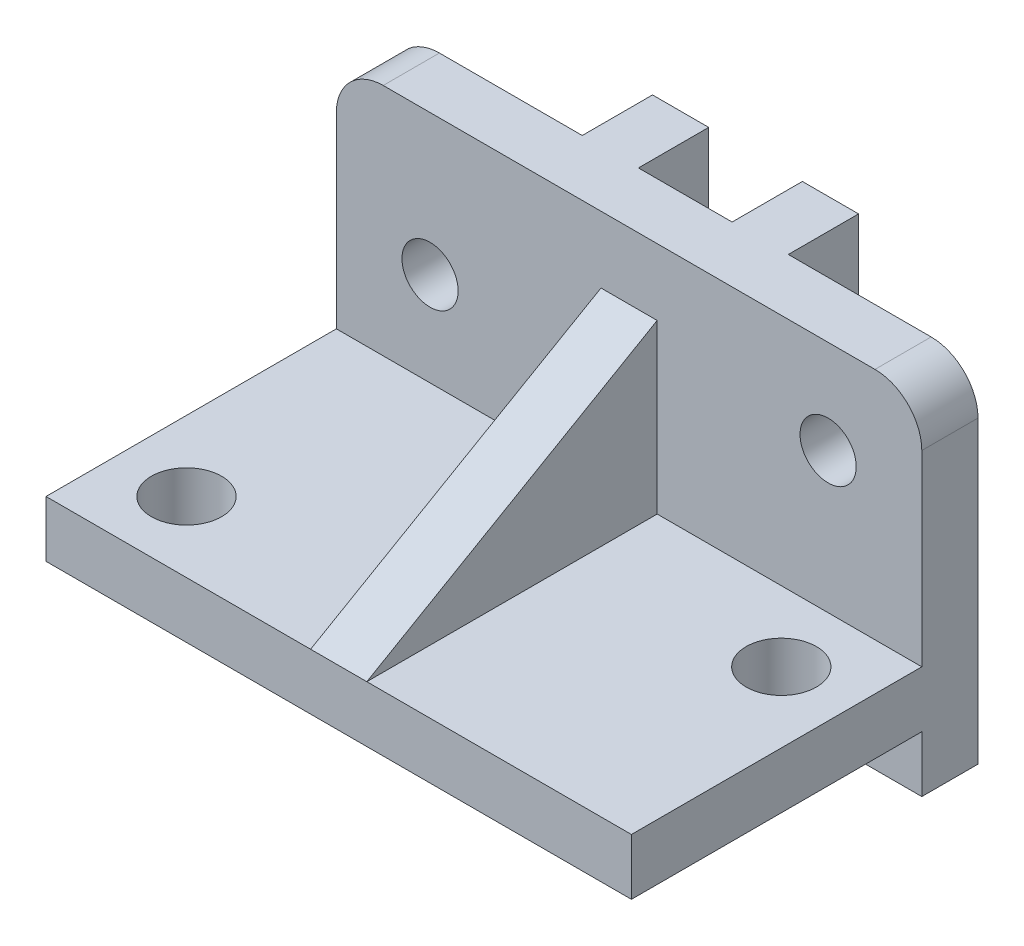
ISO-10303-21;
HEADER;
FILE_DESCRIPTION(('STEP AP214'),'2;1');
FILE_NAME('part.step','',(''),(''),'','','');
FILE_SCHEMA(('AUTOMOTIVE_DESIGN { 1 0 10303 214 1 1 1 1 }'));
ENDSEC;
DATA;
#1=APPLICATION_CONTEXT('core data for automotive mechanical design processes');
#2=APPLICATION_PROTOCOL_DEFINITION('international standard','automotive_design',2000,#1);
#3=PRODUCT_CONTEXT('',#1,'mechanical');
#4=PRODUCT('Part','Part','',(#3));
#5=PRODUCT_RELATED_PRODUCT_CATEGORY('part','',(#4));
#6=PRODUCT_DEFINITION_FORMATION('','',#4);
#7=PRODUCT_DEFINITION_CONTEXT('part definition',#1,'design');
#8=PRODUCT_DEFINITION('design','',#6,#7);
#9=PRODUCT_DEFINITION_SHAPE('','',#8);
#10=(LENGTH_UNIT() NAMED_UNIT(*) SI_UNIT(.MILLI.,.METRE.));
#11=(NAMED_UNIT(*) PLANE_ANGLE_UNIT() SI_UNIT($,.RADIAN.));
#12=(NAMED_UNIT(*) SI_UNIT($,.STERADIAN.) SOLID_ANGLE_UNIT());
#13=UNCERTAINTY_MEASURE_WITH_UNIT(LENGTH_MEASURE(1.E-05),#10,'distance_accuracy_value','');
#14=(GEOMETRIC_REPRESENTATION_CONTEXT(3) GLOBAL_UNCERTAINTY_ASSIGNED_CONTEXT((#13)) GLOBAL_UNIT_ASSIGNED_CONTEXT((#10,
#11,#12)) REPRESENTATION_CONTEXT('',''));
#15=CARTESIAN_POINT('',(0.,0.,0.));
#16=DIRECTION('',(0.,0.,1.));
#17=DIRECTION('',(1.,0.,0.));
#18=AXIS2_PLACEMENT_3D('',#15,#16,#17);
#19=CARTESIAN_POINT('',(0.,12.,0.));
#20=DIRECTION('',(0.,1.,0.));
#21=DIRECTION('',(0.,0.,1.));
#22=AXIS2_PLACEMENT_3D('',#19,#20,#21);
#23=PLANE('',#22);
#24=CARTESIAN_POINT('',(110.,12.,-47.));
#25=DIRECTION('',(0.,1.,0.));
#26=DIRECTION('',(0.,0.,1.));
#27=AXIS2_PLACEMENT_3D('',#24,#25,#26);
#28=CIRCLE('',#27,7.50000000000001);
#29=CARTESIAN_POINT('',(110.,12.,-39.5));
#30=VERTEX_POINT('',#29);
#31=EDGE_CURVE('E237',#30,#30,#28,.T.);
#32=ORIENTED_EDGE('',*,*,#31,.F.);
#33=EDGE_LOOP('',(#32));
#34=FACE_BOUND('',#33,.T.);
#35=DIRECTION('',(1.,0.,0.));
#36=VECTOR('',#35,1.);
#37=CARTESIAN_POINT('',(0.,12.,-62.));
#38=LINE('',#37,#36);
#39=CARTESIAN_POINT('',(68.5,12.,-62.));
#40=VERTEX_POINT('',#39);
#41=CARTESIAN_POINT('',(125.,12.,-62.));
#42=VERTEX_POINT('',#41);
#43=EDGE_CURVE('E213',#40,#42,#38,.T.);
#44=ORIENTED_EDGE('',*,*,#43,.F.);
#45=DIRECTION('',(0.,0.,-1.));
#46=VECTOR('',#45,1.);
#47=CARTESIAN_POINT('',(68.5,12.,-62.));
#48=LINE('',#47,#46);
#49=CARTESIAN_POINT('',(68.5,12.,0.));
#50=VERTEX_POINT('',#49);
#51=EDGE_CURVE('E186',#50,#40,#48,.T.);
#52=ORIENTED_EDGE('',*,*,#51,.F.);
#53=DIRECTION('',(1.,0.,0.));
#54=VECTOR('',#53,1.);
#55=CARTESIAN_POINT('',(0.,12.,0.));
#56=LINE('',#55,#54);
#57=CARTESIAN_POINT('',(125.,12.,0.));
#58=VERTEX_POINT('',#57);
#59=EDGE_CURVE('E196',#50,#58,#56,.T.);
#60=ORIENTED_EDGE('',*,*,#59,.T.);
#61=DIRECTION('',(0.,0.,-1.));
#62=VECTOR('',#61,1.);
#63=CARTESIAN_POINT('',(125.,12.,0.));
#64=LINE('',#63,#62);
#65=EDGE_CURVE('E210',#58,#42,#64,.T.);
#66=ORIENTED_EDGE('',*,*,#65,.T.);
#67=EDGE_LOOP('',(#44,#52,#60,#66));
#68=FACE_BOUND('',#67,.T.);
#69=ADVANCED_FACE('F37',(#34,#68),#23,.T.);
#70=CARTESIAN_POINT('',(15.,12.,-15.));
#71=DIRECTION('',(0.,1.,0.));
#72=DIRECTION('',(0.,0.,1.));
#73=AXIS2_PLACEMENT_3D('',#70,#71,#72);
#74=CIRCLE('',#73,7.5);
#75=CARTESIAN_POINT('',(15.,12.,-7.5));
#76=VERTEX_POINT('',#75);
#77=EDGE_CURVE('E215',#76,#76,#74,.T.);
#78=ORIENTED_EDGE('',*,*,#77,.F.);
#79=EDGE_LOOP('',(#78));
#80=FACE_BOUND('',#79,.T.);
#81=CARTESIAN_POINT('',(0.,12.,0.));
#82=VERTEX_POINT('',#81);
#83=CARTESIAN_POINT('',(56.5,12.,0.));
#84=VERTEX_POINT('',#83);
#85=EDGE_CURVE('E193',#82,#84,#56,.T.);
#86=ORIENTED_EDGE('',*,*,#85,.T.);
#87=DIRECTION('',(0.,0.,1.));
#88=VECTOR('',#87,1.);
#89=CARTESIAN_POINT('',(56.5,12.,0.));
#90=LINE('',#89,#88);
#91=CARTESIAN_POINT('',(56.5,12.,-62.));
#92=VERTEX_POINT('',#91);
#93=EDGE_CURVE('E200',#92,#84,#90,.T.);
#94=ORIENTED_EDGE('',*,*,#93,.F.);
#95=CARTESIAN_POINT('',(0.,12.,-62.));
#96=VERTEX_POINT('',#95);
#97=EDGE_CURVE('E219',#96,#92,#38,.T.);
#98=ORIENTED_EDGE('',*,*,#97,.F.);
#99=DIRECTION('',(0.,0.,-1.));
#100=VECTOR('',#99,1.);
#101=CARTESIAN_POINT('',(0.,12.,0.));
#102=LINE('',#101,#100);
#103=EDGE_CURVE('E209',#82,#96,#102,.T.);
#104=ORIENTED_EDGE('',*,*,#103,.F.);
#105=EDGE_LOOP('',(#86,#94,#98,#104));
#106=FACE_BOUND('',#105,.T.);
#107=ADVANCED_FACE('F207',(#80,#106),#23,.T.);
#108=CARTESIAN_POINT('',(0.,62.,-62.));
#109=DIRECTION('',(0.,0.,-1.));
#110=DIRECTION('',(-1.,0.,0.));
#111=AXIS2_PLACEMENT_3D('',#108,#109,#110);
#112=PLANE('',#111);
#113=CARTESIAN_POINT('',(20.,32.,-62.));
#114=DIRECTION('',(0.,0.,1.));
#115=DIRECTION('',(1.,0.,0.));
#116=AXIS2_PLACEMENT_3D('',#113,#114,#115);
#117=CIRCLE('',#116,6.);
#118=CARTESIAN_POINT('',(26.,32.,-62.));
#119=VERTEX_POINT('',#118);
#120=EDGE_CURVE('E703',#119,#119,#117,.T.);
#121=ORIENTED_EDGE('',*,*,#120,.F.);
#122=EDGE_LOOP('',(#121));
#123=FACE_BOUND('',#122,.T.);
#124=DIRECTION('',(0.,-1.,0.));
#125=VECTOR('',#124,1.);
#126=CARTESIAN_POINT('',(56.5,62.,-62.));
#127=LINE('',#126,#125);
#128=CARTESIAN_POINT('',(56.5,47.7957166897563,-62.));
#129=VERTEX_POINT('',#128);
#130=EDGE_CURVE('E202',#129,#92,#127,.T.);
#131=ORIENTED_EDGE('',*,*,#130,.F.);
#132=DIRECTION('',(1.,0.,0.));
#133=VECTOR('',#132,1.);
#134=CARTESIAN_POINT('',(-0.00100000000001488,47.7957166897563,-62.));
#135=LINE('',#134,#133);
#136=CARTESIAN_POINT('',(68.5,47.7957166897563,-62.));
#137=VERTEX_POINT('',#136);
#138=EDGE_CURVE('E52',#129,#137,#135,.T.);
#139=ORIENTED_EDGE('',*,*,#138,.T.);
#140=DIRECTION('',(0.,-1.,0.));
#141=VECTOR('',#140,1.);
#142=CARTESIAN_POINT('',(68.5,62.,-62.));
#143=LINE('',#142,#141);
#144=EDGE_CURVE('E658',#137,#40,#143,.T.);
#145=ORIENTED_EDGE('',*,*,#144,.T.);
#146=ORIENTED_EDGE('',*,*,#43,.T.);
#147=DIRECTION('',(0.,-1.,0.));
#148=VECTOR('',#147,1.);
#149=CARTESIAN_POINT('',(125.,62.,-62.));
#150=LINE('',#149,#148);
#151=CARTESIAN_POINT('',(125.,52.,-62.));
#152=VERTEX_POINT('',#151);
#153=EDGE_CURVE('E279',#152,#42,#150,.T.);
#154=ORIENTED_EDGE('',*,*,#153,.F.);
#155=CARTESIAN_POINT('',(115.,52.,-62.));
#156=DIRECTION('',(0.,0.,-1.));
#157=DIRECTION('',(1.,0.,0.));
#158=AXIS2_PLACEMENT_3D('',#155,#156,#157);
#159=CIRCLE('',#158,9.99999999999999);
#160=CARTESIAN_POINT('',(115.,62.,-62.));
#161=VERTEX_POINT('',#160);
#162=EDGE_CURVE('E707',#161,#152,#159,.T.);
#163=ORIENTED_EDGE('',*,*,#162,.F.);
#164=DIRECTION('',(1.,0.,0.));
#165=VECTOR('',#164,1.);
#166=CARTESIAN_POINT('',(0.,62.,-62.));
#167=LINE('',#166,#165);
#168=CARTESIAN_POINT('',(9.99999999999999,62.,-62.));
#169=VERTEX_POINT('',#168);
#170=EDGE_CURVE('E276',#169,#161,#167,.T.);
#171=ORIENTED_EDGE('',*,*,#170,.F.);
#172=CARTESIAN_POINT('',(10.,52.,-62.));
#173=DIRECTION('',(0.,0.,-1.));
#174=DIRECTION('',(-1.,0.,0.));
#175=AXIS2_PLACEMENT_3D('',#172,#173,#174);
#176=CIRCLE('',#175,9.99999999999999);
#177=CARTESIAN_POINT('',(0.,52.,-62.));
#178=VERTEX_POINT('',#177);
#179=EDGE_CURVE('E719',#178,#169,#176,.T.);
#180=ORIENTED_EDGE('',*,*,#179,.F.);
#181=DIRECTION('',(0.,-1.,0.));
#182=VECTOR('',#181,1.);
#183=CARTESIAN_POINT('',(0.,62.,-62.));
#184=LINE('',#183,#182);
#185=EDGE_CURVE('E282',#178,#96,#184,.T.);
#186=ORIENTED_EDGE('',*,*,#185,.T.);
#187=ORIENTED_EDGE('',*,*,#97,.T.);
#188=EDGE_LOOP('',(#131,#139,#145,#146,#154,#163,#171,#180,#186,#187));
#189=FACE_BOUND('',#188,.T.);
#190=CARTESIAN_POINT('',(105.,42.,-62.));
#191=DIRECTION('',(0.,0.,1.));
#192=DIRECTION('',(1.,0.,0.));
#193=AXIS2_PLACEMENT_3D('',#190,#191,#192);
#194=CIRCLE('',#193,6.);
#195=CARTESIAN_POINT('',(111.,42.,-62.));
#196=VERTEX_POINT('',#195);
#197=EDGE_CURVE('E714',#196,#196,#194,.T.);
#198=ORIENTED_EDGE('',*,*,#197,.F.);
#199=EDGE_LOOP('',(#198));
#200=FACE_BOUND('',#199,.T.);
#201=ADVANCED_FACE('F297',(#123,#189,#200),#112,.F.);
#202=CARTESIAN_POINT('',(0.,62.,-74.));
#203=DIRECTION('',(0.,0.,-1.));
#204=DIRECTION('',(-1.,0.,0.));
#205=AXIS2_PLACEMENT_3D('',#202,#203,#204);
#206=PLANE('',#205);
#207=DIRECTION('',(1.,0.,0.));
#208=VECTOR('',#207,1.);
#209=CARTESIAN_POINT('',(0.,-12.,-74.));
#210=LINE('',#209,#208);
#211=CARTESIAN_POINT('',(52.5,-12.,-74.));
#212=VERTEX_POINT('',#211);
#213=CARTESIAN_POINT('',(72.5,-12.,-74.));
#214=VERTEX_POINT('',#213);
#215=EDGE_CURVE('E632',#212,#214,#210,.T.);
#216=ORIENTED_EDGE('',*,*,#215,.F.);
#217=DIRECTION('',(0.,-1.,0.));
#218=VECTOR('',#217,1.);
#219=CARTESIAN_POINT('',(52.5,62.,-74.));
#220=LINE('',#219,#218);
#221=CARTESIAN_POINT('',(52.5,62.,-74.));
#222=VERTEX_POINT('',#221);
#223=EDGE_CURVE('E633',#222,#212,#220,.T.);
#224=ORIENTED_EDGE('',*,*,#223,.F.);
#225=DIRECTION('',(1.,0.,0.));
#226=VECTOR('',#225,1.);
#227=CARTESIAN_POINT('',(0.,62.,-74.));
#228=LINE('',#227,#226);
#229=CARTESIAN_POINT('',(72.5,62.,-74.));
#230=VERTEX_POINT('',#229);
#231=EDGE_CURVE('E277',#222,#230,#228,.T.);
#232=ORIENTED_EDGE('',*,*,#231,.T.);
#233=DIRECTION('',(0.,1.,0.));
#234=VECTOR('',#233,1.);
#235=CARTESIAN_POINT('',(72.5,62.,-74.));
#236=LINE('',#235,#234);
#237=EDGE_CURVE('E636',#214,#230,#236,.T.);
#238=ORIENTED_EDGE('',*,*,#237,.F.);
#239=EDGE_LOOP('',(#216,#224,#232,#238));
#240=FACE_BOUND('',#239,.T.);
#241=ADVANCED_FACE('F303',(#240),#206,.T.);
#242=CARTESIAN_POINT('',(20.,32.,-74.));
#243=DIRECTION('',(0.,0.,-1.));
#244=DIRECTION('',(-1.,0.,0.));
#245=AXIS2_PLACEMENT_3D('',#242,#243,#244);
#246=CIRCLE('',#245,6.);
#247=CARTESIAN_POINT('',(14.,32.,-74.));
#248=VERTEX_POINT('',#247);
#249=EDGE_CURVE('E711',#248,#248,#246,.F.);
#250=ORIENTED_EDGE('',*,*,#249,.T.);
#251=EDGE_LOOP('',(#250));
#252=FACE_BOUND('',#251,.T.);
#253=CARTESIAN_POINT('',(10.,62.,-74.));
#254=VERTEX_POINT('',#253);
#255=CARTESIAN_POINT('',(40.5,62.,-74.));
#256=VERTEX_POINT('',#255);
#257=EDGE_CURVE('E273',#254,#256,#228,.T.);
#258=ORIENTED_EDGE('',*,*,#257,.T.);
#259=DIRECTION('',(0.,1.,0.));
#260=VECTOR('',#259,1.);
#261=CARTESIAN_POINT('',(40.5,62.,-74.));
#262=LINE('',#261,#260);
#263=CARTESIAN_POINT('',(40.5,-12.,-74.));
#264=VERTEX_POINT('',#263);
#265=EDGE_CURVE('E669',#264,#256,#262,.T.);
#266=ORIENTED_EDGE('',*,*,#265,.F.);
#267=CARTESIAN_POINT('',(0.,-12.,-74.));
#268=VERTEX_POINT('',#267);
#269=EDGE_CURVE('E639',#268,#264,#210,.T.);
#270=ORIENTED_EDGE('',*,*,#269,.F.);
#271=DIRECTION('',(0.,-1.,0.));
#272=VECTOR('',#271,1.);
#273=CARTESIAN_POINT('',(0.,62.,-74.));
#274=LINE('',#273,#272);
#275=CARTESIAN_POINT('',(0.,52.,-74.));
#276=VERTEX_POINT('',#275);
#277=EDGE_CURVE('E284',#276,#268,#274,.T.);
#278=ORIENTED_EDGE('',*,*,#277,.F.);
#279=CARTESIAN_POINT('',(10.,52.,-74.));
#280=DIRECTION('',(0.,0.,-1.));
#281=DIRECTION('',(-1.,0.,0.));
#282=AXIS2_PLACEMENT_3D('',#279,#280,#281);
#283=CIRCLE('',#282,9.99999999999999);
#284=EDGE_CURVE('E708',#276,#254,#283,.T.);
#285=ORIENTED_EDGE('',*,*,#284,.T.);
#286=EDGE_LOOP('',(#258,#266,#270,#278,#285));
#287=FACE_BOUND('',#286,.T.);
#288=ADVANCED_FACE('F319',(#252,#287),#206,.T.);
#289=CARTESIAN_POINT('',(125.,12.,0.));
#290=DIRECTION('',(-1.,0.,0.));
#291=DIRECTION('',(0.,0.,1.));
#292=AXIS2_PLACEMENT_3D('',#289,#290,#291);
#293=PLANE('',#292);
#294=DIRECTION('',(0.,0.,1.));
#295=VECTOR('',#294,1.);
#296=CARTESIAN_POINT('',(125.,52.,-74.001));
#297=LINE('',#296,#295);
#298=CARTESIAN_POINT('',(125.,52.,-74.));
#299=VERTEX_POINT('',#298);
#300=EDGE_CURVE('E266',#299,#152,#297,.T.);
#301=ORIENTED_EDGE('',*,*,#300,.T.);
#302=ORIENTED_EDGE('',*,*,#153,.T.);
#303=ORIENTED_EDGE('',*,*,#65,.F.);
#304=DIRECTION('',(0.,-1.,0.));
#305=VECTOR('',#304,1.);
#306=CARTESIAN_POINT('',(125.,12.,0.));
#307=LINE('',#306,#305);
#308=CARTESIAN_POINT('',(125.,0.,0.));
#309=VERTEX_POINT('',#308);
#310=EDGE_CURVE('E11',#58,#309,#307,.T.);
#311=ORIENTED_EDGE('',*,*,#310,.T.);
#312=DIRECTION('',(0.,0.,-1.));
#313=VECTOR('',#312,1.);
#314=CARTESIAN_POINT('',(125.,0.,0.));
#315=LINE('',#314,#313);
#316=CARTESIAN_POINT('',(125.,0.,-62.));
#317=VERTEX_POINT('',#316);
#318=EDGE_CURVE('E232',#309,#317,#315,.T.);
#319=ORIENTED_EDGE('',*,*,#318,.T.);
#320=DIRECTION('',(0.,1.,0.));
#321=VECTOR('',#320,1.);
#322=CARTESIAN_POINT('',(125.,-12.,-62.));
#323=LINE('',#322,#321);
#324=CARTESIAN_POINT('',(125.,-12.,-62.));
#325=VERTEX_POINT('',#324);
#326=EDGE_CURVE('E254',#325,#317,#323,.T.);
#327=ORIENTED_EDGE('',*,*,#326,.F.);
#328=DIRECTION('',(0.,0.,1.));
#329=VECTOR('',#328,1.);
#330=CARTESIAN_POINT('',(125.,-12.,0.));
#331=LINE('',#330,#329);
#332=CARTESIAN_POINT('',(125.,-12.,-74.));
#333=VERTEX_POINT('',#332);
#334=EDGE_CURVE('E260',#333,#325,#331,.T.);
#335=ORIENTED_EDGE('',*,*,#334,.F.);
#336=DIRECTION('',(0.,-1.,0.));
#337=VECTOR('',#336,1.);
#338=CARTESIAN_POINT('',(125.,62.,-74.));
#339=LINE('',#338,#337);
#340=EDGE_CURVE('E226',#299,#333,#339,.T.);
#341=ORIENTED_EDGE('',*,*,#340,.F.);
#342=EDGE_LOOP('',(#301,#302,#303,#311,#319,#327,#335,#341));
#343=FACE_BOUND('',#342,.T.);
#344=ADVANCED_FACE('F316',(#343),#293,.F.);
#345=CARTESIAN_POINT('',(0.,12.,0.));
#346=DIRECTION('',(-1.,0.,0.));
#347=DIRECTION('',(0.,0.,1.));
#348=AXIS2_PLACEMENT_3D('',#345,#346,#347);
#349=PLANE('',#348);
#350=ORIENTED_EDGE('',*,*,#185,.F.);
#351=DIRECTION('',(0.,0.,1.));
#352=VECTOR('',#351,1.);
#353=CARTESIAN_POINT('',(0.,52.,-74.001));
#354=LINE('',#353,#352);
#355=EDGE_CURVE('E717',#276,#178,#354,.T.);
#356=ORIENTED_EDGE('',*,*,#355,.F.);
#357=ORIENTED_EDGE('',*,*,#277,.T.);
#358=DIRECTION('',(0.,0.,-1.));
#359=VECTOR('',#358,1.);
#360=CARTESIAN_POINT('',(0.,-12.,0.));
#361=LINE('',#360,#359);
#362=CARTESIAN_POINT('',(0.,-12.,-62.));
#363=VERTEX_POINT('',#362);
#364=EDGE_CURVE('E250',#363,#268,#361,.T.);
#365=ORIENTED_EDGE('',*,*,#364,.F.);
#366=DIRECTION('',(0.,1.,0.));
#367=VECTOR('',#366,1.);
#368=CARTESIAN_POINT('',(0.,-12.,-62.));
#369=LINE('',#368,#367);
#370=CARTESIAN_POINT('',(0.,0.,-62.));
#371=VERTEX_POINT('',#370);
#372=EDGE_CURVE('E247',#363,#371,#369,.T.);
#373=ORIENTED_EDGE('',*,*,#372,.T.);
#374=DIRECTION('',(0.,0.,-1.));
#375=VECTOR('',#374,1.);
#376=CARTESIAN_POINT('',(0.,0.,0.));
#377=LINE('',#376,#375);
#378=CARTESIAN_POINT('',(0.,0.,0.));
#379=VERTEX_POINT('',#378);
#380=EDGE_CURVE('E235',#379,#371,#377,.T.);
#381=ORIENTED_EDGE('',*,*,#380,.F.);
#382=DIRECTION('',(0.,-1.,0.));
#383=VECTOR('',#382,1.);
#384=CARTESIAN_POINT('',(0.,12.,0.));
#385=LINE('',#384,#383);
#386=EDGE_CURVE('E45',#82,#379,#385,.T.);
#387=ORIENTED_EDGE('',*,*,#386,.F.);
#388=ORIENTED_EDGE('',*,*,#103,.T.);
#389=EDGE_LOOP('',(#350,#356,#357,#365,#373,#381,#387,#388));
#390=FACE_BOUND('',#389,.T.);
#391=ADVANCED_FACE('F245',(#390),#349,.T.);
#392=CARTESIAN_POINT('',(0.,62.,0.));
#393=DIRECTION('',(0.,1.,0.));
#394=DIRECTION('',(0.,0.,1.));
#395=AXIS2_PLACEMENT_3D('',#392,#393,#394);
#396=PLANE('',#395);
#397=ORIENTED_EDGE('',*,*,#170,.T.);
#398=DIRECTION('',(0.,0.,1.));
#399=VECTOR('',#398,1.);
#400=CARTESIAN_POINT('',(115.,62.,-74.001));
#401=LINE('',#400,#399);
#402=CARTESIAN_POINT('',(115.,62.,-74.));
#403=VERTEX_POINT('',#402);
#404=EDGE_CURVE('E261',#403,#161,#401,.T.);
#405=ORIENTED_EDGE('',*,*,#404,.F.);
#406=CARTESIAN_POINT('',(84.5,62.,-74.));
#407=VERTEX_POINT('',#406);
#408=EDGE_CURVE('E271',#407,#403,#228,.T.);
#409=ORIENTED_EDGE('',*,*,#408,.F.);
#410=DIRECTION('',(0.,0.,1.));
#411=VECTOR('',#410,1.);
#412=CARTESIAN_POINT('',(84.5,62.,-89.));
#413=LINE('',#412,#411);
#414=CARTESIAN_POINT('',(84.5,62.,-89.));
#415=VERTEX_POINT('',#414);
#416=EDGE_CURVE('E700',#415,#407,#413,.T.);
#417=ORIENTED_EDGE('',*,*,#416,.F.);
#418=DIRECTION('',(1.,0.,0.));
#419=VECTOR('',#418,1.);
#420=CARTESIAN_POINT('',(84.5,62.,-89.));
#421=LINE('',#420,#419);
#422=CARTESIAN_POINT('',(72.5,62.,-89.));
#423=VERTEX_POINT('',#422);
#424=EDGE_CURVE('E681',#423,#415,#421,.T.);
#425=ORIENTED_EDGE('',*,*,#424,.F.);
#426=DIRECTION('',(0.,0.,1.));
#427=VECTOR('',#426,1.);
#428=CARTESIAN_POINT('',(72.5,62.,-89.));
#429=LINE('',#428,#427);
#430=EDGE_CURVE('E690',#423,#230,#429,.T.);
#431=ORIENTED_EDGE('',*,*,#430,.T.);
#432=ORIENTED_EDGE('',*,*,#231,.F.);
#433=DIRECTION('',(0.,0.,1.));
#434=VECTOR('',#433,1.);
#435=CARTESIAN_POINT('',(52.5,62.,-89.));
#436=LINE('',#435,#434);
#437=CARTESIAN_POINT('',(52.5,62.,-89.));
#438=VERTEX_POINT('',#437);
#439=EDGE_CURVE('E660',#438,#222,#436,.T.);
#440=ORIENTED_EDGE('',*,*,#439,.F.);
#441=DIRECTION('',(1.,0.,0.));
#442=VECTOR('',#441,1.);
#443=CARTESIAN_POINT('',(52.5,62.,-89.));
#444=LINE('',#443,#442);
#445=CARTESIAN_POINT('',(40.5,62.,-89.));
#446=VERTEX_POINT('',#445);
#447=EDGE_CURVE('E671',#446,#438,#444,.T.);
#448=ORIENTED_EDGE('',*,*,#447,.F.);
#449=DIRECTION('',(0.,0.,1.));
#450=VECTOR('',#449,1.);
#451=CARTESIAN_POINT('',(40.5,62.,-89.));
#452=LINE('',#451,#450);
#453=EDGE_CURVE('E665',#446,#256,#452,.T.);
#454=ORIENTED_EDGE('',*,*,#453,.T.);
#455=ORIENTED_EDGE('',*,*,#257,.F.);
#456=DIRECTION('',(0.,0.,1.));
#457=VECTOR('',#456,1.);
#458=CARTESIAN_POINT('',(9.99999999999999,62.,-74.001));
#459=LINE('',#458,#457);
#460=EDGE_CURVE('E720',#254,#169,#459,.T.);
#461=ORIENTED_EDGE('',*,*,#460,.T.);
#462=EDGE_LOOP('',(#397,#405,#409,#417,#425,#431,#432,#440,#448,#454,#455,#461));
#463=FACE_BOUND('',#462,.T.);
#464=ADVANCED_FACE('F315',(#463),#396,.T.);
#465=CARTESIAN_POINT('',(0.,12.,0.));
#466=DIRECTION('',(0.,0.,-1.));
#467=DIRECTION('',(-1.,0.,0.));
#468=AXIS2_PLACEMENT_3D('',#465,#466,#467);
#469=PLANE('',#468);
#470=ORIENTED_EDGE('',*,*,#59,.F.);
#471=DIRECTION('',(1.,0.,0.));
#472=VECTOR('',#471,1.);
#473=CARTESIAN_POINT('',(-0.001000000000001,12.,0.));
#474=LINE('',#473,#472);
#475=EDGE_CURVE('E181',#84,#50,#474,.T.);
#476=ORIENTED_EDGE('',*,*,#475,.F.);
#477=ORIENTED_EDGE('',*,*,#85,.F.);
#478=ORIENTED_EDGE('',*,*,#386,.T.);
#479=DIRECTION('',(1.,0.,0.));
#480=VECTOR('',#479,1.);
#481=CARTESIAN_POINT('',(0.,0.,0.));
#482=LINE('',#481,#480);
#483=EDGE_CURVE('E229',#379,#309,#482,.T.);
#484=ORIENTED_EDGE('',*,*,#483,.T.);
#485=ORIENTED_EDGE('',*,*,#310,.F.);
#486=EDGE_LOOP('',(#470,#476,#477,#478,#484,#485));
#487=FACE_BOUND('',#486,.T.);
#488=ADVANCED_FACE('F191',(#487),#469,.F.);
#489=CARTESIAN_POINT('',(15.,12.,-15.));
#490=DIRECTION('',(0.,-1.,0.));
#491=DIRECTION('',(0.,0.,-1.));
#492=AXIS2_PLACEMENT_3D('',#489,#490,#491);
#493=CYLINDRICAL_SURFACE('',#492,7.5);
#494=ORIENTED_EDGE('',*,*,#77,.T.);
#495=EDGE_LOOP('',(#494));
#496=FACE_BOUND('',#495,.T.);
#497=CARTESIAN_POINT('',(15.,0.,-15.));
#498=DIRECTION('',(0.,1.,0.));
#499=DIRECTION('',(0.,0.,1.));
#500=AXIS2_PLACEMENT_3D('',#497,#498,#499);
#501=CIRCLE('',#500,7.5);
#502=CARTESIAN_POINT('',(15.,0.,-7.5));
#503=VERTEX_POINT('',#502);
#504=EDGE_CURVE('E225',#503,#503,#501,.T.);
#505=ORIENTED_EDGE('',*,*,#504,.F.);
#506=EDGE_LOOP('',(#505));
#507=FACE_BOUND('',#506,.T.);
#508=ADVANCED_FACE('F293',(#496,#507),#493,.F.);
#509=CARTESIAN_POINT('',(110.,12.,-47.));
#510=DIRECTION('',(0.,-1.,0.));
#511=DIRECTION('',(0.,0.,-1.));
#512=AXIS2_PLACEMENT_3D('',#509,#510,#511);
#513=CYLINDRICAL_SURFACE('',#512,7.50000000000001);
#514=ORIENTED_EDGE('',*,*,#31,.T.);
#515=EDGE_LOOP('',(#514));
#516=FACE_BOUND('',#515,.T.);
#517=CARTESIAN_POINT('',(110.,0.,-47.));
#518=DIRECTION('',(0.,1.,0.));
#519=DIRECTION('',(0.,0.,1.));
#520=AXIS2_PLACEMENT_3D('',#517,#518,#519);
#521=CIRCLE('',#520,7.50000000000001);
#522=CARTESIAN_POINT('',(110.,0.,-39.5));
#523=VERTEX_POINT('',#522);
#524=EDGE_CURVE('E222',#523,#523,#521,.T.);
#525=ORIENTED_EDGE('',*,*,#524,.F.);
#526=EDGE_LOOP('',(#525));
#527=FACE_BOUND('',#526,.T.);
#528=ADVANCED_FACE('F39',(#516,#527),#513,.F.);
#529=CARTESIAN_POINT('',(0.,0.,0.));
#530=DIRECTION('',(0.,1.,0.));
#531=DIRECTION('',(0.,0.,1.));
#532=AXIS2_PLACEMENT_3D('',#529,#530,#531);
#533=PLANE('',#532);
#534=ORIENTED_EDGE('',*,*,#524,.T.);
#535=EDGE_LOOP('',(#534));
#536=FACE_BOUND('',#535,.T.);
#537=ORIENTED_EDGE('',*,*,#504,.T.);
#538=EDGE_LOOP('',(#537));
#539=FACE_BOUND('',#538,.T.);
#540=ORIENTED_EDGE('',*,*,#380,.T.);
#541=DIRECTION('',(1.,0.,0.));
#542=VECTOR('',#541,1.);
#543=CARTESIAN_POINT('',(0.,0.,-62.));
#544=LINE('',#543,#542);
#545=EDGE_CURVE('E257',#371,#317,#544,.T.);
#546=ORIENTED_EDGE('',*,*,#545,.T.);
#547=ORIENTED_EDGE('',*,*,#318,.F.);
#548=ORIENTED_EDGE('',*,*,#483,.F.);
#549=EDGE_LOOP('',(#540,#546,#547,#548));
#550=FACE_BOUND('',#549,.T.);
#551=ADVANCED_FACE('F242',(#536,#539,#550),#533,.F.);
#552=DIRECTION('',(0.,-1.,0.));
#553=VECTOR('',#552,1.);
#554=CARTESIAN_POINT('',(84.5,62.,-74.));
#555=LINE('',#554,#553);
#556=CARTESIAN_POINT('',(84.5,-12.,-74.));
#557=VERTEX_POINT('',#556);
#558=EDGE_CURVE('E673',#407,#557,#555,.T.);
#559=ORIENTED_EDGE('',*,*,#558,.F.);
#560=ORIENTED_EDGE('',*,*,#408,.T.);
#561=CARTESIAN_POINT('',(115.,52.,-74.));
#562=DIRECTION('',(0.,0.,-1.));
#563=DIRECTION('',(-1.,0.,0.));
#564=AXIS2_PLACEMENT_3D('',#561,#562,#563);
#565=CIRCLE('',#564,9.99999999999999);
#566=EDGE_CURVE('E704',#403,#299,#565,.T.);
#567=ORIENTED_EDGE('',*,*,#566,.T.);
#568=ORIENTED_EDGE('',*,*,#340,.T.);
#569=EDGE_CURVE('E263',#557,#333,#210,.T.);
#570=ORIENTED_EDGE('',*,*,#569,.F.);
#571=EDGE_LOOP('',(#559,#560,#567,#568,#570));
#572=FACE_BOUND('',#571,.T.);
#573=CARTESIAN_POINT('',(105.,42.,-74.));
#574=DIRECTION('',(0.,0.,-1.));
#575=DIRECTION('',(-1.,0.,0.));
#576=AXIS2_PLACEMENT_3D('',#573,#574,#575);
#577=CIRCLE('',#576,6.);
#578=CARTESIAN_POINT('',(99.,42.,-74.));
#579=VERTEX_POINT('',#578);
#580=EDGE_CURVE('E723',#579,#579,#577,.F.);
#581=ORIENTED_EDGE('',*,*,#580,.T.);
#582=EDGE_LOOP('',(#581));
#583=FACE_BOUND('',#582,.T.);
#584=ADVANCED_FACE('F309',(#572,#583),#206,.T.);
#585=CARTESIAN_POINT('',(0.,-12.,-62.));
#586=DIRECTION('',(0.,0.,1.));
#587=DIRECTION('',(1.,0.,0.));
#588=AXIS2_PLACEMENT_3D('',#585,#586,#587);
#589=PLANE('',#588);
#590=ORIENTED_EDGE('',*,*,#545,.F.);
#591=ORIENTED_EDGE('',*,*,#372,.F.);
#592=DIRECTION('',(1.,0.,0.));
#593=VECTOR('',#592,1.);
#594=CARTESIAN_POINT('',(0.,-12.,-62.));
#595=LINE('',#594,#593);
#596=EDGE_CURVE('E255',#363,#325,#595,.T.);
#597=ORIENTED_EDGE('',*,*,#596,.T.);
#598=ORIENTED_EDGE('',*,*,#326,.T.);
#599=EDGE_LOOP('',(#590,#591,#597,#598));
#600=FACE_BOUND('',#599,.T.);
#601=ADVANCED_FACE('F258',(#600),#589,.T.);
#602=CARTESIAN_POINT('',(0.,-12.,0.));
#603=DIRECTION('',(0.,1.,0.));
#604=DIRECTION('',(0.,0.,1.));
#605=AXIS2_PLACEMENT_3D('',#602,#603,#604);
#606=PLANE('',#605);
#607=ORIENTED_EDGE('',*,*,#334,.T.);
#608=ORIENTED_EDGE('',*,*,#596,.F.);
#609=ORIENTED_EDGE('',*,*,#364,.T.);
#610=ORIENTED_EDGE('',*,*,#269,.T.);
#611=DIRECTION('',(0.,0.,1.));
#612=VECTOR('',#611,1.);
#613=CARTESIAN_POINT('',(40.5,-12.,-89.));
#614=LINE('',#613,#612);
#615=CARTESIAN_POINT('',(40.5,-12.,-89.));
#616=VERTEX_POINT('',#615);
#617=EDGE_CURVE('E663',#616,#264,#614,.T.);
#618=ORIENTED_EDGE('',*,*,#617,.F.);
#619=DIRECTION('',(-1.,0.,0.));
#620=VECTOR('',#619,1.);
#621=CARTESIAN_POINT('',(52.5,-12.,-89.));
#622=LINE('',#621,#620);
#623=CARTESIAN_POINT('',(52.5,-12.,-89.));
#624=VERTEX_POINT('',#623);
#625=EDGE_CURVE('E675',#624,#616,#622,.T.);
#626=ORIENTED_EDGE('',*,*,#625,.F.);
#627=DIRECTION('',(0.,0.,1.));
#628=VECTOR('',#627,1.);
#629=CARTESIAN_POINT('',(52.5,-12.,-89.));
#630=LINE('',#629,#628);
#631=EDGE_CURVE('E60',#624,#212,#630,.T.);
#632=ORIENTED_EDGE('',*,*,#631,.T.);
#633=ORIENTED_EDGE('',*,*,#215,.T.);
#634=DIRECTION('',(0.,0.,1.));
#635=VECTOR('',#634,1.);
#636=CARTESIAN_POINT('',(72.5,-12.,-89.));
#637=LINE('',#636,#635);
#638=CARTESIAN_POINT('',(72.5,-12.,-89.));
#639=VERTEX_POINT('',#638);
#640=EDGE_CURVE('E696',#639,#214,#637,.T.);
#641=ORIENTED_EDGE('',*,*,#640,.F.);
#642=DIRECTION('',(-1.,0.,0.));
#643=VECTOR('',#642,1.);
#644=CARTESIAN_POINT('',(84.5,-12.,-89.));
#645=LINE('',#644,#643);
#646=CARTESIAN_POINT('',(84.5,-12.,-89.));
#647=VERTEX_POINT('',#646);
#648=EDGE_CURVE('E686',#647,#639,#645,.T.);
#649=ORIENTED_EDGE('',*,*,#648,.F.);
#650=DIRECTION('',(0.,0.,1.));
#651=VECTOR('',#650,1.);
#652=CARTESIAN_POINT('',(84.5,-12.,-89.));
#653=LINE('',#652,#651);
#654=EDGE_CURVE('E698',#647,#557,#653,.T.);
#655=ORIENTED_EDGE('',*,*,#654,.T.);
#656=ORIENTED_EDGE('',*,*,#569,.T.);
#657=EDGE_LOOP('',(#607,#608,#609,#610,#618,#626,#632,#633,#641,#649,#655,#656));
#658=FACE_BOUND('',#657,.T.);
#659=ADVANCED_FACE('F350',(#658),#606,.F.);
#660=CARTESIAN_POINT('',(10.,52.,-74.001));
#661=DIRECTION('',(0.,0.,1.));
#662=DIRECTION('',(1.,0.,0.));
#663=AXIS2_PLACEMENT_3D('',#660,#661,#662);
#664=CYLINDRICAL_SURFACE('',#663,9.99999999999999);
#665=ORIENTED_EDGE('',*,*,#355,.T.);
#666=ORIENTED_EDGE('',*,*,#179,.T.);
#667=ORIENTED_EDGE('',*,*,#460,.F.);
#668=ORIENTED_EDGE('',*,*,#284,.F.);
#669=EDGE_LOOP('',(#665,#666,#667,#668));
#670=FACE_BOUND('',#669,.T.);
#671=ADVANCED_FACE('F357',(#670),#664,.T.);
#672=CARTESIAN_POINT('',(115.,52.,-74.001));
#673=DIRECTION('',(0.,0.,1.));
#674=DIRECTION('',(1.,0.,0.));
#675=AXIS2_PLACEMENT_3D('',#672,#673,#674);
#676=CYLINDRICAL_SURFACE('',#675,9.99999999999999);
#677=ORIENTED_EDGE('',*,*,#404,.T.);
#678=ORIENTED_EDGE('',*,*,#162,.T.);
#679=ORIENTED_EDGE('',*,*,#300,.F.);
#680=ORIENTED_EDGE('',*,*,#566,.F.);
#681=EDGE_LOOP('',(#677,#678,#679,#680));
#682=FACE_BOUND('',#681,.T.);
#683=ADVANCED_FACE('F365',(#682),#676,.T.);
#684=CARTESIAN_POINT('',(105.,42.,-74.001));
#685=DIRECTION('',(0.,0.,1.));
#686=DIRECTION('',(1.,0.,0.));
#687=AXIS2_PLACEMENT_3D('',#684,#685,#686);
#688=CYLINDRICAL_SURFACE('',#687,6.);
#689=ORIENTED_EDGE('',*,*,#580,.F.);
#690=EDGE_LOOP('',(#689));
#691=FACE_BOUND('',#690,.T.);
#692=ORIENTED_EDGE('',*,*,#197,.T.);
#693=EDGE_LOOP('',(#692));
#694=FACE_BOUND('',#693,.T.);
#695=ADVANCED_FACE('F374',(#691,#694),#688,.F.);
#696=CARTESIAN_POINT('',(20.,32.,-74.001));
#697=DIRECTION('',(0.,0.,1.));
#698=DIRECTION('',(1.,0.,0.));
#699=AXIS2_PLACEMENT_3D('',#696,#697,#698);
#700=CYLINDRICAL_SURFACE('',#699,6.);
#701=ORIENTED_EDGE('',*,*,#249,.F.);
#702=EDGE_LOOP('',(#701));
#703=FACE_BOUND('',#702,.T.);
#704=ORIENTED_EDGE('',*,*,#120,.T.);
#705=EDGE_LOOP('',(#704));
#706=FACE_BOUND('',#705,.T.);
#707=ADVANCED_FACE('F382',(#703,#706),#700,.F.);
#708=CARTESIAN_POINT('',(84.5,62.,-89.));
#709=DIRECTION('',(-1.,0.,0.));
#710=DIRECTION('',(0.,-1.,0.));
#711=AXIS2_PLACEMENT_3D('',#708,#709,#710);
#712=PLANE('',#711);
#713=ORIENTED_EDGE('',*,*,#558,.T.);
#714=ORIENTED_EDGE('',*,*,#654,.F.);
#715=DIRECTION('',(0.,-1.,0.));
#716=VECTOR('',#715,1.);
#717=CARTESIAN_POINT('',(84.5,62.,-89.));
#718=LINE('',#717,#716);
#719=EDGE_CURVE('E684',#415,#647,#718,.T.);
#720=ORIENTED_EDGE('',*,*,#719,.F.);
#721=ORIENTED_EDGE('',*,*,#416,.T.);
#722=EDGE_LOOP('',(#713,#714,#720,#721));
#723=FACE_BOUND('',#722,.T.);
#724=ADVANCED_FACE('F390',(#723),#712,.F.);
#725=CARTESIAN_POINT('',(72.5,62.,-89.));
#726=DIRECTION('',(1.,0.,0.));
#727=DIRECTION('',(0.,1.,0.));
#728=AXIS2_PLACEMENT_3D('',#725,#726,#727);
#729=PLANE('',#728);
#730=ORIENTED_EDGE('',*,*,#237,.T.);
#731=ORIENTED_EDGE('',*,*,#430,.F.);
#732=DIRECTION('',(0.,1.,0.));
#733=VECTOR('',#732,1.);
#734=CARTESIAN_POINT('',(72.5,62.,-89.));
#735=LINE('',#734,#733);
#736=EDGE_CURVE('E688',#639,#423,#735,.T.);
#737=ORIENTED_EDGE('',*,*,#736,.F.);
#738=ORIENTED_EDGE('',*,*,#640,.T.);
#739=EDGE_LOOP('',(#730,#731,#737,#738));
#740=FACE_BOUND('',#739,.T.);
#741=ADVANCED_FACE('F398',(#740),#729,.F.);
#742=CARTESIAN_POINT('',(0.,0.,-89.));
#743=DIRECTION('',(0.,0.,1.));
#744=DIRECTION('',(1.,0.,0.));
#745=AXIS2_PLACEMENT_3D('',#742,#743,#744);
#746=PLANE('',#745);
#747=ORIENTED_EDGE('',*,*,#424,.T.);
#748=ORIENTED_EDGE('',*,*,#719,.T.);
#749=ORIENTED_EDGE('',*,*,#648,.T.);
#750=ORIENTED_EDGE('',*,*,#736,.T.);
#751=EDGE_LOOP('',(#747,#748,#749,#750));
#752=FACE_BOUND('',#751,.T.);
#753=ADVANCED_FACE('F406',(#752),#746,.F.);
#754=CARTESIAN_POINT('',(52.5,62.,-89.));
#755=DIRECTION('',(-1.,0.,0.));
#756=DIRECTION('',(0.,-1.,0.));
#757=AXIS2_PLACEMENT_3D('',#754,#755,#756);
#758=PLANE('',#757);
#759=ORIENTED_EDGE('',*,*,#223,.T.);
#760=ORIENTED_EDGE('',*,*,#631,.F.);
#761=DIRECTION('',(0.,-1.,0.));
#762=VECTOR('',#761,1.);
#763=CARTESIAN_POINT('',(52.5,62.,-89.));
#764=LINE('',#763,#762);
#765=EDGE_CURVE('E677',#438,#624,#764,.T.);
#766=ORIENTED_EDGE('',*,*,#765,.F.);
#767=ORIENTED_EDGE('',*,*,#439,.T.);
#768=EDGE_LOOP('',(#759,#760,#766,#767));
#769=FACE_BOUND('',#768,.T.);
#770=ADVANCED_FACE('F414',(#769),#758,.F.);
#771=CARTESIAN_POINT('',(40.5,62.,-89.));
#772=DIRECTION('',(1.,0.,0.));
#773=DIRECTION('',(0.,1.,0.));
#774=AXIS2_PLACEMENT_3D('',#771,#772,#773);
#775=PLANE('',#774);
#776=ORIENTED_EDGE('',*,*,#265,.T.);
#777=ORIENTED_EDGE('',*,*,#453,.F.);
#778=DIRECTION('',(0.,1.,0.));
#779=VECTOR('',#778,1.);
#780=CARTESIAN_POINT('',(40.5,62.,-89.));
#781=LINE('',#780,#779);
#782=EDGE_CURVE('E668',#616,#446,#781,.T.);
#783=ORIENTED_EDGE('',*,*,#782,.F.);
#784=ORIENTED_EDGE('',*,*,#617,.T.);
#785=EDGE_LOOP('',(#776,#777,#783,#784));
#786=FACE_BOUND('',#785,.T.);
#787=ADVANCED_FACE('F422',(#786),#775,.F.);
#788=CARTESIAN_POINT('',(0.,0.,-89.));
#789=DIRECTION('',(0.,0.,1.));
#790=DIRECTION('',(1.,0.,0.));
#791=AXIS2_PLACEMENT_3D('',#788,#789,#790);
#792=PLANE('',#791);
#793=ORIENTED_EDGE('',*,*,#447,.T.);
#794=ORIENTED_EDGE('',*,*,#765,.T.);
#795=ORIENTED_EDGE('',*,*,#625,.T.);
#796=ORIENTED_EDGE('',*,*,#782,.T.);
#797=EDGE_LOOP('',(#793,#794,#795,#796));
#798=FACE_BOUND('',#797,.T.);
#799=ADVANCED_FACE('F430',(#798),#792,.F.);
#800=CARTESIAN_POINT('',(68.5,62.,-62.));
#801=DIRECTION('',(-1.,0.,0.));
#802=DIRECTION('',(0.,0.,1.));
#803=AXIS2_PLACEMENT_3D('',#800,#801,#802);
#804=PLANE('',#803);
#805=ORIENTED_EDGE('',*,*,#144,.F.);
#806=DIRECTION('',(0.,0.499999999999995,-0.866025403784442));
#807=VECTOR('',#806,1.);
#808=CARTESIAN_POINT('',(68.5,12.,0.));
#809=LINE('',#808,#807);
#810=EDGE_CURVE('E197',#50,#137,#809,.T.);
#811=ORIENTED_EDGE('',*,*,#810,.F.);
#812=ORIENTED_EDGE('',*,*,#51,.T.);
#813=EDGE_LOOP('',(#805,#811,#812));
#814=FACE_BOUND('',#813,.T.);
#815=ADVANCED_FACE('F438',(#814),#804,.F.);
#816=CARTESIAN_POINT('',(56.5,62.,0.));
#817=DIRECTION('',(1.,0.,0.));
#818=DIRECTION('',(0.,0.,-1.));
#819=AXIS2_PLACEMENT_3D('',#816,#817,#818);
#820=PLANE('',#819);
#821=ORIENTED_EDGE('',*,*,#93,.T.);
#822=DIRECTION('',(0.,-0.499999999999995,0.866025403784442));
#823=VECTOR('',#822,1.);
#824=CARTESIAN_POINT('',(56.5,12.,0.));
#825=LINE('',#824,#823);
#826=EDGE_CURVE('E178',#129,#84,#825,.T.);
#827=ORIENTED_EDGE('',*,*,#826,.F.);
#828=ORIENTED_EDGE('',*,*,#130,.T.);
#829=EDGE_LOOP('',(#821,#827,#828));
#830=FACE_BOUND('',#829,.T.);
#831=ADVANCED_FACE('F201',(#830),#820,.F.);
#832=CARTESIAN_POINT('',(-0.001000000000001,12.,0.));
#833=DIRECTION('',(0.,-0.866025403784442,-0.499999999999995));
#834=DIRECTION('',(0.,0.499999999999995,-0.866025403784442));
#835=AXIS2_PLACEMENT_3D('',#832,#833,#834);
#836=PLANE('',#835);
#837=ORIENTED_EDGE('',*,*,#826,.T.);
#838=ORIENTED_EDGE('',*,*,#475,.T.);
#839=ORIENTED_EDGE('',*,*,#810,.T.);
#840=ORIENTED_EDGE('',*,*,#138,.F.);
#841=EDGE_LOOP('',(#837,#838,#839,#840));
#842=FACE_BOUND('',#841,.T.);
#843=ADVANCED_FACE('F180',(#842),#836,.F.);
#844=CLOSED_SHELL('',(#69,#107,#201,#241,#288,#344,#391,#464,#488,#508,#528,#551,#584,#601,#659,
#671,#683,#695,#707,#724,#741,#753,#770,#787,#799,#815,#831,#843));
#845=MANIFOLD_SOLID_BREP('B2',#844);
#846=ADVANCED_BREP_SHAPE_REPRESENTATION('',(#18,#845),#14);
#847=SHAPE_DEFINITION_REPRESENTATION(#9,#846);
ENDSEC;
END-ISO-10303-21;
